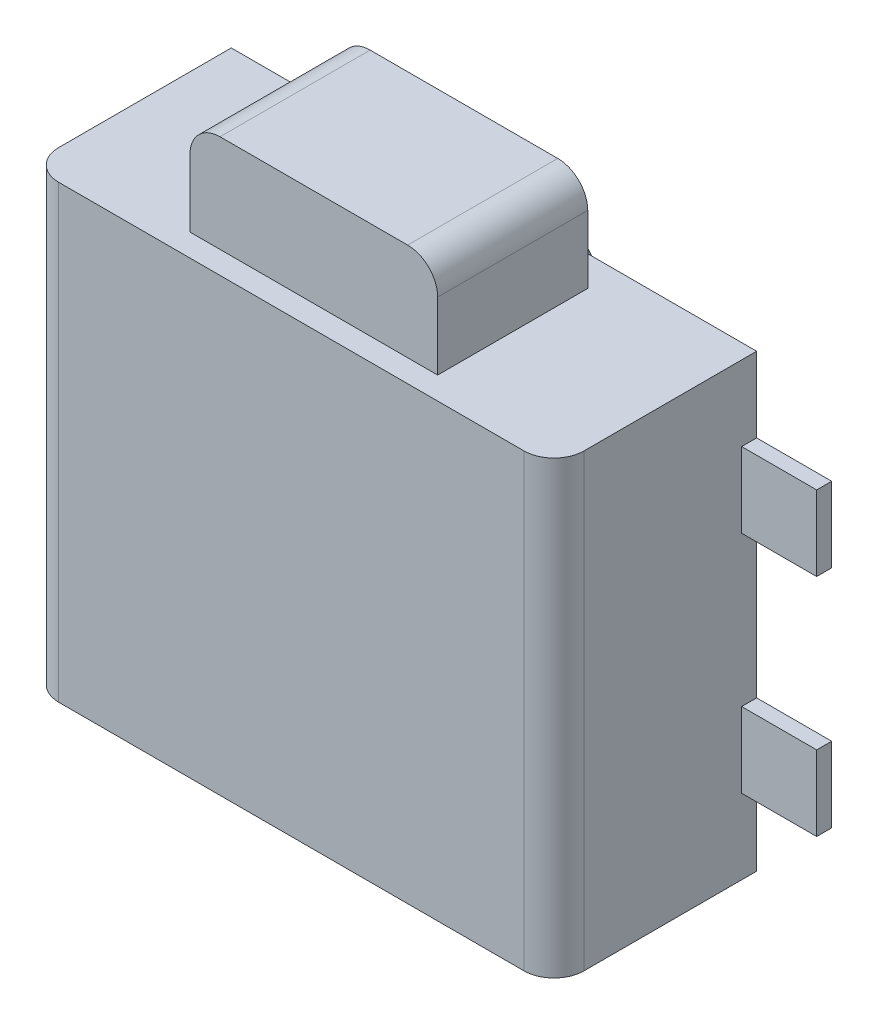
ISO-10303-21;
HEADER;
FILE_DESCRIPTION(('STEP AP214'),'2;1');
FILE_NAME('part.step','',(''),(''),'','','');
FILE_SCHEMA(('AUTOMOTIVE_DESIGN { 1 0 10303 214 1 1 1 1 }'));
ENDSEC;
DATA;
#1=APPLICATION_CONTEXT('core data for automotive mechanical design processes');
#2=APPLICATION_PROTOCOL_DEFINITION('international standard','automotive_design',2000,#1);
#3=PRODUCT_CONTEXT('',#1,'mechanical');
#4=PRODUCT('Part','Part','',(#3));
#5=PRODUCT_RELATED_PRODUCT_CATEGORY('part','',(#4));
#6=PRODUCT_DEFINITION_FORMATION('','',#4);
#7=PRODUCT_DEFINITION_CONTEXT('part definition',#1,'design');
#8=PRODUCT_DEFINITION('design','',#6,#7);
#9=PRODUCT_DEFINITION_SHAPE('','',#8);
#10=(LENGTH_UNIT() NAMED_UNIT(*) SI_UNIT(.MILLI.,.METRE.));
#11=(NAMED_UNIT(*) PLANE_ANGLE_UNIT() SI_UNIT($,.RADIAN.));
#12=(NAMED_UNIT(*) SI_UNIT($,.STERADIAN.) SOLID_ANGLE_UNIT());
#13=UNCERTAINTY_MEASURE_WITH_UNIT(LENGTH_MEASURE(1.E-05),#10,'distance_accuracy_value','');
#14=(GEOMETRIC_REPRESENTATION_CONTEXT(3) GLOBAL_UNCERTAINTY_ASSIGNED_CONTEXT((#13)) GLOBAL_UNIT_ASSIGNED_CONTEXT((#10,
#11,#12)) REPRESENTATION_CONTEXT('',''));
#15=CARTESIAN_POINT('',(0.,0.,0.));
#16=DIRECTION('',(0.,0.,1.));
#17=DIRECTION('',(1.,0.,0.));
#18=AXIS2_PLACEMENT_3D('',#15,#16,#17);
#19=CARTESIAN_POINT('',(-1.75,1.5,0.));
#20=DIRECTION('',(-1.,0.,0.));
#21=DIRECTION('',(0.,-1.,0.));
#22=AXIS2_PLACEMENT_3D('',#19,#20,#21);
#23=PLANE('',#22);
#24=DIRECTION('',(0.,0.,1.));
#25=VECTOR('',#24,1.);
#26=CARTESIAN_POINT('',(-1.75,0.999999999999999,0.));
#27=LINE('',#26,#25);
#28=CARTESIAN_POINT('',(-1.75,0.999999999999999,0.));
#29=VERTEX_POINT('',#28);
#30=CARTESIAN_POINT('',(-1.75,0.999999999999999,0.1));
#31=VERTEX_POINT('',#30);
#32=EDGE_CURVE('E260',#29,#31,#27,.T.);
#33=ORIENTED_EDGE('',*,*,#32,.T.);
#34=DIRECTION('',(0.,-1.,0.));
#35=VECTOR('',#34,1.);
#36=CARTESIAN_POINT('',(-1.75,1.5,0.1));
#37=LINE('',#36,#35);
#38=CARTESIAN_POINT('',(-1.75,0.499999999999999,0.1));
#39=VERTEX_POINT('',#38);
#40=EDGE_CURVE('E257',#31,#39,#37,.T.);
#41=ORIENTED_EDGE('',*,*,#40,.T.);
#42=DIRECTION('',(0.,0.,1.));
#43=VECTOR('',#42,1.);
#44=CARTESIAN_POINT('',(-1.75,0.499999999999999,0.));
#45=LINE('',#44,#43);
#46=CARTESIAN_POINT('',(-1.75,0.499999999999999,0.));
#47=VERTEX_POINT('',#46);
#48=EDGE_CURVE('E263',#39,#47,#45,.F.);
#49=ORIENTED_EDGE('',*,*,#48,.T.);
#50=DIRECTION('',(0.,-1.,0.));
#51=VECTOR('',#50,1.);
#52=CARTESIAN_POINT('',(-1.75,1.5,0.));
#53=LINE('',#52,#51);
#54=CARTESIAN_POINT('',(-1.75,-0.499999999999999,0.));
#55=VERTEX_POINT('',#54);
#56=EDGE_CURVE('E265',#47,#55,#53,.T.);
#57=ORIENTED_EDGE('',*,*,#56,.T.);
#58=DIRECTION('',(0.,0.,1.));
#59=VECTOR('',#58,1.);
#60=CARTESIAN_POINT('',(-1.75,-0.499999999999999,0.));
#61=LINE('',#60,#59);
#62=CARTESIAN_POINT('',(-1.75,-0.499999999999999,0.1));
#63=VERTEX_POINT('',#62);
#64=EDGE_CURVE('E276',#55,#63,#61,.T.);
#65=ORIENTED_EDGE('',*,*,#64,.T.);
#66=DIRECTION('',(0.,-1.,0.));
#67=VECTOR('',#66,1.);
#68=CARTESIAN_POINT('',(-1.75,1.5,0.1));
#69=LINE('',#68,#67);
#70=CARTESIAN_POINT('',(-1.75,-0.999999999999999,0.1));
#71=VERTEX_POINT('',#70);
#72=EDGE_CURVE('E285',#63,#71,#69,.T.);
#73=ORIENTED_EDGE('',*,*,#72,.T.);
#74=DIRECTION('',(0.,0.,1.));
#75=VECTOR('',#74,1.);
#76=CARTESIAN_POINT('',(-1.75,-0.999999999999999,0.));
#77=LINE('',#76,#75);
#78=CARTESIAN_POINT('',(-1.75,-0.999999999999999,0.));
#79=VERTEX_POINT('',#78);
#80=EDGE_CURVE('E295',#71,#79,#77,.F.);
#81=ORIENTED_EDGE('',*,*,#80,.T.);
#82=DIRECTION('',(0.,-1.,0.));
#83=VECTOR('',#82,1.);
#84=CARTESIAN_POINT('',(-1.75,1.5,0.));
#85=LINE('',#84,#83);
#86=CARTESIAN_POINT('',(-1.75,-1.5,0.));
#87=VERTEX_POINT('',#86);
#88=EDGE_CURVE('E201',#79,#87,#85,.T.);
#89=ORIENTED_EDGE('',*,*,#88,.T.);
#90=DIRECTION('',(0.,0.,1.));
#91=VECTOR('',#90,1.);
#92=CARTESIAN_POINT('',(-1.75,-1.5,0.));
#93=LINE('',#92,#91);
#94=CARTESIAN_POINT('',(-1.75,-1.5,1.15));
#95=VERTEX_POINT('',#94);
#96=EDGE_CURVE('E197',#87,#95,#93,.T.);
#97=ORIENTED_EDGE('',*,*,#96,.T.);
#98=DIRECTION('',(0.,-1.,0.));
#99=VECTOR('',#98,1.);
#100=CARTESIAN_POINT('',(-1.75,2.3,1.15));
#101=LINE('',#100,#99);
#102=CARTESIAN_POINT('',(-1.75,1.5,1.15));
#103=VERTEX_POINT('',#102);
#104=EDGE_CURVE('E199',#103,#95,#101,.T.);
#105=ORIENTED_EDGE('',*,*,#104,.F.);
#106=DIRECTION('',(0.,0.,1.));
#107=VECTOR('',#106,1.);
#108=CARTESIAN_POINT('',(-1.75,1.5,0.));
#109=LINE('',#108,#107);
#110=CARTESIAN_POINT('',(-1.75,1.5,0.));
#111=VERTEX_POINT('',#110);
#112=EDGE_CURVE('E206',#103,#111,#109,.F.);
#113=ORIENTED_EDGE('',*,*,#112,.T.);
#114=DIRECTION('',(0.,-1.,0.));
#115=VECTOR('',#114,1.);
#116=CARTESIAN_POINT('',(-1.75,1.5,0.));
#117=LINE('',#116,#115);
#118=EDGE_CURVE('E316',#111,#29,#117,.T.);
#119=ORIENTED_EDGE('',*,*,#118,.T.);
#120=EDGE_LOOP('',(#33,#41,#49,#57,#65,#73,#81,#89,#97,#105,#113,#119));
#121=FACE_BOUND('',#120,.T.);
#122=ADVANCED_FACE('F15',(#121),#23,.T.);
#123=CARTESIAN_POINT('',(1.75,-1.5,0.));
#124=DIRECTION('',(1.,0.,0.));
#125=DIRECTION('',(0.,1.,0.));
#126=AXIS2_PLACEMENT_3D('',#123,#124,#125);
#127=PLANE('',#126);
#128=DIRECTION('',(0.,0.,1.));
#129=VECTOR('',#128,1.);
#130=CARTESIAN_POINT('',(1.75,0.5,0.));
#131=LINE('',#130,#129);
#132=CARTESIAN_POINT('',(1.75,0.5,0.));
#133=VERTEX_POINT('',#132);
#134=CARTESIAN_POINT('',(1.75,0.5,0.1));
#135=VERTEX_POINT('',#134);
#136=EDGE_CURVE('E326',#133,#135,#131,.T.);
#137=ORIENTED_EDGE('',*,*,#136,.T.);
#138=DIRECTION('',(0.,1.,0.));
#139=VECTOR('',#138,1.);
#140=CARTESIAN_POINT('',(1.75,-1.5,0.1));
#141=LINE('',#140,#139);
#142=CARTESIAN_POINT('',(1.75,1.,0.1));
#143=VERTEX_POINT('',#142);
#144=EDGE_CURVE('E215',#135,#143,#141,.T.);
#145=ORIENTED_EDGE('',*,*,#144,.T.);
#146=DIRECTION('',(0.,0.,1.));
#147=VECTOR('',#146,1.);
#148=CARTESIAN_POINT('',(1.75,1.,0.));
#149=LINE('',#148,#147);
#150=CARTESIAN_POINT('',(1.75,1.,0.));
#151=VERTEX_POINT('',#150);
#152=EDGE_CURVE('E259',#143,#151,#149,.F.);
#153=ORIENTED_EDGE('',*,*,#152,.T.);
#154=DIRECTION('',(0.,1.,0.));
#155=VECTOR('',#154,1.);
#156=CARTESIAN_POINT('',(1.75,-1.5,0.));
#157=LINE('',#156,#155);
#158=CARTESIAN_POINT('',(1.75,1.5,0.));
#159=VERTEX_POINT('',#158);
#160=EDGE_CURVE('E330',#151,#159,#157,.T.);
#161=ORIENTED_EDGE('',*,*,#160,.T.);
#162=DIRECTION('',(0.,0.,1.));
#163=VECTOR('',#162,1.);
#164=CARTESIAN_POINT('',(1.75,1.5,0.));
#165=LINE('',#164,#163);
#166=CARTESIAN_POINT('',(1.75,1.5,1.15));
#167=VERTEX_POINT('',#166);
#168=EDGE_CURVE('E339',#159,#167,#165,.T.);
#169=ORIENTED_EDGE('',*,*,#168,.T.);
#170=DIRECTION('',(0.,1.,0.));
#171=VECTOR('',#170,1.);
#172=CARTESIAN_POINT('',(1.75,-2.3,1.15));
#173=LINE('',#172,#171);
#174=CARTESIAN_POINT('',(1.75,-1.5,1.15));
#175=VERTEX_POINT('',#174);
#176=EDGE_CURVE('E221',#175,#167,#173,.T.);
#177=ORIENTED_EDGE('',*,*,#176,.F.);
#178=DIRECTION('',(0.,0.,1.));
#179=VECTOR('',#178,1.);
#180=CARTESIAN_POINT('',(1.75,-1.5,0.));
#181=LINE('',#180,#179);
#182=CARTESIAN_POINT('',(1.75,-1.5,0.));
#183=VERTEX_POINT('',#182);
#184=EDGE_CURVE('E349',#175,#183,#181,.F.);
#185=ORIENTED_EDGE('',*,*,#184,.T.);
#186=DIRECTION('',(0.,1.,0.));
#187=VECTOR('',#186,1.);
#188=CARTESIAN_POINT('',(1.75,-1.5,0.));
#189=LINE('',#188,#187);
#190=CARTESIAN_POINT('',(1.75,-1.,0.));
#191=VERTEX_POINT('',#190);
#192=EDGE_CURVE('E346',#183,#191,#189,.T.);
#193=ORIENTED_EDGE('',*,*,#192,.T.);
#194=DIRECTION('',(0.,0.,1.));
#195=VECTOR('',#194,1.);
#196=CARTESIAN_POINT('',(1.75,-1.,0.));
#197=LINE('',#196,#195);
#198=CARTESIAN_POINT('',(1.75,-1.,0.1));
#199=VERTEX_POINT('',#198);
#200=EDGE_CURVE('E348',#191,#199,#197,.T.);
#201=ORIENTED_EDGE('',*,*,#200,.T.);
#202=DIRECTION('',(0.,1.,0.));
#203=VECTOR('',#202,1.);
#204=CARTESIAN_POINT('',(1.75,-1.5,0.1));
#205=LINE('',#204,#203);
#206=CARTESIAN_POINT('',(1.75,-0.5,0.1));
#207=VERTEX_POINT('',#206);
#208=EDGE_CURVE('E367',#199,#207,#205,.T.);
#209=ORIENTED_EDGE('',*,*,#208,.T.);
#210=DIRECTION('',(0.,0.,1.));
#211=VECTOR('',#210,1.);
#212=CARTESIAN_POINT('',(1.75,-0.5,0.));
#213=LINE('',#212,#211);
#214=CARTESIAN_POINT('',(1.75,-0.5,0.));
#215=VERTEX_POINT('',#214);
#216=EDGE_CURVE('E369',#207,#215,#213,.F.);
#217=ORIENTED_EDGE('',*,*,#216,.T.);
#218=DIRECTION('',(0.,1.,0.));
#219=VECTOR('',#218,1.);
#220=CARTESIAN_POINT('',(1.75,-1.5,0.));
#221=LINE('',#220,#219);
#222=EDGE_CURVE('E371',#215,#133,#221,.T.);
#223=ORIENTED_EDGE('',*,*,#222,.T.);
#224=EDGE_LOOP('',(#137,#145,#153,#161,#169,#177,#185,#193,#201,#209,#217,#223));
#225=FACE_BOUND('',#224,.T.);
#226=ADVANCED_FACE('F577',(#225),#127,.T.);
#227=CARTESIAN_POINT('',(-1.55,2.3,1.15));
#228=DIRECTION('',(0.,-1.,0.));
#229=DIRECTION('',(1.,0.,0.));
#230=AXIS2_PLACEMENT_3D('',#227,#228,#229);
#231=CYLINDRICAL_SURFACE('',#230,0.2);
#232=DIRECTION('',(0.,1.,0.));
#233=VECTOR('',#232,1.);
#234=CARTESIAN_POINT('',(-1.55,0.,1.35));
#235=LINE('',#234,#233);
#236=CARTESIAN_POINT('',(-1.55,1.5,1.35));
#237=VERTEX_POINT('',#236);
#238=CARTESIAN_POINT('',(-1.55,-1.5,1.35));
#239=VERTEX_POINT('',#238);
#240=EDGE_CURVE('E388',#237,#239,#235,.F.);
#241=ORIENTED_EDGE('',*,*,#240,.F.);
#242=CARTESIAN_POINT('',(-1.55,1.5,1.15));
#243=DIRECTION('',(0.,-1.,0.));
#244=DIRECTION('',(1.,0.,0.));
#245=AXIS2_PLACEMENT_3D('',#242,#243,#244);
#246=CIRCLE('',#245,0.2);
#247=EDGE_CURVE('E214',#237,#103,#246,.T.);
#248=ORIENTED_EDGE('',*,*,#247,.T.);
#249=ORIENTED_EDGE('',*,*,#104,.T.);
#250=CARTESIAN_POINT('',(-1.55,-1.5,1.15));
#251=DIRECTION('',(0.,-1.,0.));
#252=DIRECTION('',(1.,0.,0.));
#253=AXIS2_PLACEMENT_3D('',#250,#251,#252);
#254=CIRCLE('',#253,0.2);
#255=EDGE_CURVE('E18',#95,#239,#254,.F.);
#256=ORIENTED_EDGE('',*,*,#255,.T.);
#257=EDGE_LOOP('',(#241,#248,#249,#256));
#258=FACE_BOUND('',#257,.T.);
#259=ADVANCED_FACE('F212',(#258),#231,.T.);
#260=CARTESIAN_POINT('',(1.55,-2.3,1.15));
#261=DIRECTION('',(0.,1.,0.));
#262=DIRECTION('',(-1.,0.,0.));
#263=AXIS2_PLACEMENT_3D('',#260,#261,#262);
#264=CYLINDRICAL_SURFACE('',#263,0.2);
#265=DIRECTION('',(0.,1.,0.));
#266=VECTOR('',#265,1.);
#267=CARTESIAN_POINT('',(1.55,0.,1.35));
#268=LINE('',#267,#266);
#269=CARTESIAN_POINT('',(1.55,-1.5,1.35));
#270=VERTEX_POINT('',#269);
#271=CARTESIAN_POINT('',(1.55,1.5,1.35));
#272=VERTEX_POINT('',#271);
#273=EDGE_CURVE('E394',#270,#272,#268,.T.);
#274=ORIENTED_EDGE('',*,*,#273,.F.);
#275=CARTESIAN_POINT('',(1.55,-1.5,1.15));
#276=DIRECTION('',(0.,1.,0.));
#277=DIRECTION('',(-1.,0.,0.));
#278=AXIS2_PLACEMENT_3D('',#275,#276,#277);
#279=CIRCLE('',#278,0.2);
#280=EDGE_CURVE('E227',#270,#175,#279,.T.);
#281=ORIENTED_EDGE('',*,*,#280,.T.);
#282=ORIENTED_EDGE('',*,*,#176,.T.);
#283=CARTESIAN_POINT('',(1.55,1.5,1.15));
#284=DIRECTION('',(0.,1.,0.));
#285=DIRECTION('',(-1.,0.,0.));
#286=AXIS2_PLACEMENT_3D('',#283,#284,#285);
#287=CIRCLE('',#286,0.2);
#288=EDGE_CURVE('E223',#167,#272,#287,.F.);
#289=ORIENTED_EDGE('',*,*,#288,.T.);
#290=EDGE_LOOP('',(#274,#281,#282,#289));
#291=FACE_BOUND('',#290,.T.);
#292=ADVANCED_FACE('F598',(#291),#264,.T.);
#293=CARTESIAN_POINT('',(0.625,1.95,2.));
#294=DIRECTION('',(0.,0.,-1.));
#295=DIRECTION('',(-1.,0.,0.));
#296=AXIS2_PLACEMENT_3D('',#293,#294,#295);
#297=CYLINDRICAL_SURFACE('',#296,0.2);
#298=DIRECTION('',(0.,0.,1.));
#299=VECTOR('',#298,1.);
#300=CARTESIAN_POINT('',(0.625,2.15,0.));
#301=LINE('',#300,#299);
#302=CARTESIAN_POINT('',(0.625,2.15,1.2));
#303=VERTEX_POINT('',#302);
#304=CARTESIAN_POINT('',(0.625,2.15,0.2));
#305=VERTEX_POINT('',#304);
#306=EDGE_CURVE('E230',#303,#305,#301,.F.);
#307=ORIENTED_EDGE('',*,*,#306,.F.);
#308=CARTESIAN_POINT('',(0.625,1.95,1.2));
#309=DIRECTION('',(0.,0.,-1.));
#310=DIRECTION('',(-1.,0.,0.));
#311=AXIS2_PLACEMENT_3D('',#308,#309,#310);
#312=CIRCLE('',#311,0.2);
#313=CARTESIAN_POINT('',(0.825,1.95,1.2));
#314=VERTEX_POINT('',#313);
#315=EDGE_CURVE('E239',#314,#303,#312,.F.);
#316=ORIENTED_EDGE('',*,*,#315,.F.);
#317=DIRECTION('',(0.,0.,-1.));
#318=VECTOR('',#317,1.);
#319=CARTESIAN_POINT('',(0.825,1.95,1.2));
#320=LINE('',#319,#318);
#321=CARTESIAN_POINT('',(0.825,1.95,0.2));
#322=VERTEX_POINT('',#321);
#323=EDGE_CURVE('E384',#322,#314,#320,.F.);
#324=ORIENTED_EDGE('',*,*,#323,.F.);
#325=CARTESIAN_POINT('',(0.625,1.95,0.2));
#326=DIRECTION('',(0.,0.,-1.));
#327=DIRECTION('',(-1.,0.,0.));
#328=AXIS2_PLACEMENT_3D('',#325,#326,#327);
#329=CIRCLE('',#328,0.2);
#330=EDGE_CURVE('E231',#305,#322,#329,.T.);
#331=ORIENTED_EDGE('',*,*,#330,.F.);
#332=EDGE_LOOP('',(#307,#316,#324,#331));
#333=FACE_BOUND('',#332,.T.);
#334=ADVANCED_FACE('F733',(#333),#297,.T.);
#335=CARTESIAN_POINT('',(0.,2.15,0.));
#336=DIRECTION('',(0.,1.,0.));
#337=DIRECTION('',(-1.,0.,0.));
#338=AXIS2_PLACEMENT_3D('',#335,#336,#337);
#339=PLANE('',#338);
#340=DIRECTION('',(0.,0.,1.));
#341=VECTOR('',#340,1.);
#342=CARTESIAN_POINT('',(-0.625,2.15,-0.6));
#343=LINE('',#342,#341);
#344=CARTESIAN_POINT('',(-0.625,2.15,1.2));
#345=VERTEX_POINT('',#344);
#346=CARTESIAN_POINT('',(-0.625,2.15,0.2));
#347=VERTEX_POINT('',#346);
#348=EDGE_CURVE('E386',#345,#347,#343,.F.);
#349=ORIENTED_EDGE('',*,*,#348,.F.);
#350=DIRECTION('',(1.,0.,0.));
#351=VECTOR('',#350,1.);
#352=CARTESIAN_POINT('',(-0.825,2.15,1.2));
#353=LINE('',#352,#351);
#354=EDGE_CURVE('E241',#303,#345,#353,.F.);
#355=ORIENTED_EDGE('',*,*,#354,.F.);
#356=ORIENTED_EDGE('',*,*,#306,.T.);
#357=DIRECTION('',(-1.,0.,0.));
#358=VECTOR('',#357,1.);
#359=CARTESIAN_POINT('',(0.825,2.15,0.2));
#360=LINE('',#359,#358);
#361=EDGE_CURVE('E238',#347,#305,#360,.F.);
#362=ORIENTED_EDGE('',*,*,#361,.F.);
#363=EDGE_LOOP('',(#349,#355,#356,#362));
#364=FACE_BOUND('',#363,.T.);
#365=ADVANCED_FACE('F743',(#364),#339,.T.);
#366=CARTESIAN_POINT('',(-0.625,1.95,-0.6));
#367=DIRECTION('',(0.,0.,1.));
#368=DIRECTION('',(1.,0.,0.));
#369=AXIS2_PLACEMENT_3D('',#366,#367,#368);
#370=CYLINDRICAL_SURFACE('',#369,0.2);
#371=ORIENTED_EDGE('',*,*,#348,.T.);
#372=CARTESIAN_POINT('',(-0.625,1.95,0.2));
#373=DIRECTION('',(0.,0.,1.));
#374=DIRECTION('',(1.,0.,0.));
#375=AXIS2_PLACEMENT_3D('',#372,#373,#374);
#376=CIRCLE('',#375,0.2);
#377=CARTESIAN_POINT('',(-0.825,1.95,0.2));
#378=VERTEX_POINT('',#377);
#379=EDGE_CURVE('E235',#378,#347,#376,.F.);
#380=ORIENTED_EDGE('',*,*,#379,.F.);
#381=DIRECTION('',(0.,0.,1.));
#382=VECTOR('',#381,1.);
#383=CARTESIAN_POINT('',(-0.825,1.95,0.2));
#384=LINE('',#383,#382);
#385=CARTESIAN_POINT('',(-0.825,1.95,1.2));
#386=VERTEX_POINT('',#385);
#387=EDGE_CURVE('E234',#386,#378,#384,.F.);
#388=ORIENTED_EDGE('',*,*,#387,.F.);
#389=CARTESIAN_POINT('',(-0.625,1.95,1.2));
#390=DIRECTION('',(0.,0.,1.));
#391=DIRECTION('',(1.,0.,0.));
#392=AXIS2_PLACEMENT_3D('',#389,#390,#391);
#393=CIRCLE('',#392,0.2);
#394=EDGE_CURVE('E243',#345,#386,#393,.T.);
#395=ORIENTED_EDGE('',*,*,#394,.F.);
#396=EDGE_LOOP('',(#371,#380,#388,#395));
#397=FACE_BOUND('',#396,.T.);
#398=ADVANCED_FACE('F478',(#397),#370,.T.);
#399=CARTESIAN_POINT('',(0.,0.,-0.5));
#400=DIRECTION('',(0.,0.,-1.));
#401=DIRECTION('',(-1.,0.,0.));
#402=AXIS2_PLACEMENT_3D('',#399,#400,#401);
#403=PLANE('',#402);
#404=CARTESIAN_POINT('',(0.,0.9,-0.5));
#405=DIRECTION('',(0.,0.,1.));
#406=DIRECTION('',(1.,0.,0.));
#407=AXIS2_PLACEMENT_3D('',#404,#405,#406);
#408=CIRCLE('',#407,0.15);
#409=CARTESIAN_POINT('',(0.15,0.9,-0.5));
#410=VERTEX_POINT('',#409);
#411=EDGE_CURVE('E436',#410,#410,#408,.T.);
#412=ORIENTED_EDGE('',*,*,#411,.F.);
#413=EDGE_LOOP('',(#412));
#414=FACE_BOUND('',#413,.T.);
#415=ADVANCED_FACE('F473',(#414),#403,.T.);
#416=CARTESIAN_POINT('',(0.,0.,-0.5));
#417=DIRECTION('',(0.,0.,-1.));
#418=DIRECTION('',(-1.,0.,0.));
#419=AXIS2_PLACEMENT_3D('',#416,#417,#418);
#420=PLANE('',#419);
#421=CARTESIAN_POINT('',(0.,-0.9,-0.5));
#422=DIRECTION('',(0.,0.,1.));
#423=DIRECTION('',(1.,0.,0.));
#424=AXIS2_PLACEMENT_3D('',#421,#422,#423);
#425=CIRCLE('',#424,0.15);
#426=CARTESIAN_POINT('',(0.15,-0.9,-0.5));
#427=VERTEX_POINT('',#426);
#428=EDGE_CURVE('E456',#427,#427,#425,.T.);
#429=ORIENTED_EDGE('',*,*,#428,.F.);
#430=EDGE_LOOP('',(#429));
#431=FACE_BOUND('',#430,.T.);
#432=ADVANCED_FACE('F462',(#431),#420,.T.);
#433=CARTESIAN_POINT('',(0.,0.,0.1));
#434=DIRECTION('',(0.,0.,-1.));
#435=DIRECTION('',(-1.,0.,0.));
#436=AXIS2_PLACEMENT_3D('',#433,#434,#435);
#437=PLANE('',#436);
#438=DIRECTION('',(-1.,0.,0.));
#439=VECTOR('',#438,1.);
#440=CARTESIAN_POINT('',(-2.25,0.999999999999999,0.1));
#441=LINE('',#440,#439);
#442=CARTESIAN_POINT('',(-2.25,0.999999999999999,0.1));
#443=VERTEX_POINT('',#442);
#444=EDGE_CURVE('E497',#443,#31,#441,.F.);
#445=ORIENTED_EDGE('',*,*,#444,.F.);
#446=DIRECTION('',(0.,-1.,0.));
#447=VECTOR('',#446,1.);
#448=CARTESIAN_POINT('',(-2.25,0.499999999999999,0.1));
#449=LINE('',#448,#447);
#450=CARTESIAN_POINT('',(-2.25,0.499999999999999,0.1));
#451=VERTEX_POINT('',#450);
#452=EDGE_CURVE('E500',#451,#443,#449,.F.);
#453=ORIENTED_EDGE('',*,*,#452,.F.);
#454=DIRECTION('',(1.,0.,0.));
#455=VECTOR('',#454,1.);
#456=CARTESIAN_POINT('',(-1.75,0.499999999999999,0.1));
#457=LINE('',#456,#455);
#458=EDGE_CURVE('E251',#39,#451,#457,.F.);
#459=ORIENTED_EDGE('',*,*,#458,.F.);
#460=ORIENTED_EDGE('',*,*,#40,.F.);
#461=EDGE_LOOP('',(#445,#453,#459,#460));
#462=FACE_BOUND('',#461,.T.);
#463=ADVANCED_FACE('F472',(#462),#437,.F.);
#464=CARTESIAN_POINT('',(0.,0.,0.1));
#465=DIRECTION('',(0.,0.,-1.));
#466=DIRECTION('',(-1.,0.,0.));
#467=AXIS2_PLACEMENT_3D('',#464,#465,#466);
#468=PLANE('',#467);
#469=DIRECTION('',(-1.,0.,0.));
#470=VECTOR('',#469,1.);
#471=CARTESIAN_POINT('',(-2.25,-0.499999999999999,0.1));
#472=LINE('',#471,#470);
#473=CARTESIAN_POINT('',(-2.25,-0.499999999999999,0.1));
#474=VERTEX_POINT('',#473);
#475=EDGE_CURVE('E288',#474,#63,#472,.F.);
#476=ORIENTED_EDGE('',*,*,#475,.F.);
#477=DIRECTION('',(0.,-1.,0.));
#478=VECTOR('',#477,1.);
#479=CARTESIAN_POINT('',(-2.25,-0.999999999999999,0.1));
#480=LINE('',#479,#478);
#481=CARTESIAN_POINT('',(-2.25,-0.999999999999999,0.1));
#482=VERTEX_POINT('',#481);
#483=EDGE_CURVE('E291',#482,#474,#480,.F.);
#484=ORIENTED_EDGE('',*,*,#483,.F.);
#485=DIRECTION('',(1.,0.,0.));
#486=VECTOR('',#485,1.);
#487=CARTESIAN_POINT('',(-1.75,-0.999999999999999,0.1));
#488=LINE('',#487,#486);
#489=EDGE_CURVE('E298',#71,#482,#488,.F.);
#490=ORIENTED_EDGE('',*,*,#489,.F.);
#491=ORIENTED_EDGE('',*,*,#72,.F.);
#492=EDGE_LOOP('',(#476,#484,#490,#491));
#493=FACE_BOUND('',#492,.T.);
#494=ADVANCED_FACE('F689',(#493),#468,.F.);
#495=CARTESIAN_POINT('',(0.,0.,0.1));
#496=DIRECTION('',(0.,0.,-1.));
#497=DIRECTION('',(-1.,0.,0.));
#498=AXIS2_PLACEMENT_3D('',#495,#496,#497);
#499=PLANE('',#498);
#500=DIRECTION('',(1.,0.,0.));
#501=VECTOR('',#500,1.);
#502=CARTESIAN_POINT('',(2.25,-1.,0.1));
#503=LINE('',#502,#501);
#504=CARTESIAN_POINT('',(2.25,-1.,0.1));
#505=VERTEX_POINT('',#504);
#506=EDGE_CURVE('E514',#505,#199,#503,.F.);
#507=ORIENTED_EDGE('',*,*,#506,.F.);
#508=DIRECTION('',(0.,1.,0.));
#509=VECTOR('',#508,1.);
#510=CARTESIAN_POINT('',(2.25,-0.5,0.1));
#511=LINE('',#510,#509);
#512=CARTESIAN_POINT('',(2.25,-0.5,0.1));
#513=VERTEX_POINT('',#512);
#514=EDGE_CURVE('E517',#513,#505,#511,.F.);
#515=ORIENTED_EDGE('',*,*,#514,.F.);
#516=DIRECTION('',(1.,0.,0.));
#517=VECTOR('',#516,1.);
#518=CARTESIAN_POINT('',(1.75,-0.5,0.1));
#519=LINE('',#518,#517);
#520=EDGE_CURVE('E521',#207,#513,#519,.T.);
#521=ORIENTED_EDGE('',*,*,#520,.F.);
#522=ORIENTED_EDGE('',*,*,#208,.F.);
#523=EDGE_LOOP('',(#507,#515,#521,#522));
#524=FACE_BOUND('',#523,.T.);
#525=ADVANCED_FACE('F693',(#524),#499,.F.);
#526=CARTESIAN_POINT('',(0.,0.,0.1));
#527=DIRECTION('',(0.,0.,-1.));
#528=DIRECTION('',(-1.,0.,0.));
#529=AXIS2_PLACEMENT_3D('',#526,#527,#528);
#530=PLANE('',#529);
#531=DIRECTION('',(1.,0.,0.));
#532=VECTOR('',#531,1.);
#533=CARTESIAN_POINT('',(2.25,0.5,0.1));
#534=LINE('',#533,#532);
#535=CARTESIAN_POINT('',(2.25,0.5,0.1));
#536=VERTEX_POINT('',#535);
#537=EDGE_CURVE('E525',#536,#135,#534,.F.);
#538=ORIENTED_EDGE('',*,*,#537,.F.);
#539=DIRECTION('',(0.,1.,0.));
#540=VECTOR('',#539,1.);
#541=CARTESIAN_POINT('',(2.25,1.,0.1));
#542=LINE('',#541,#540);
#543=CARTESIAN_POINT('',(2.25,1.,0.1));
#544=VERTEX_POINT('',#543);
#545=EDGE_CURVE('E528',#544,#536,#542,.F.);
#546=ORIENTED_EDGE('',*,*,#545,.F.);
#547=DIRECTION('',(1.,0.,0.));
#548=VECTOR('',#547,1.);
#549=CARTESIAN_POINT('',(1.75,1.,0.1));
#550=LINE('',#549,#548);
#551=EDGE_CURVE('E320',#143,#544,#550,.T.);
#552=ORIENTED_EDGE('',*,*,#551,.F.);
#553=ORIENTED_EDGE('',*,*,#144,.F.);
#554=EDGE_LOOP('',(#538,#546,#552,#553));
#555=FACE_BOUND('',#554,.T.);
#556=ADVANCED_FACE('F698',(#555),#530,.F.);
#557=CARTESIAN_POINT('',(0.,0.,1.35));
#558=DIRECTION('',(0.,0.,1.));
#559=DIRECTION('',(1.,0.,0.));
#560=AXIS2_PLACEMENT_3D('',#557,#558,#559);
#561=PLANE('',#560);
#562=ORIENTED_EDGE('',*,*,#273,.T.);
#563=DIRECTION('',(-1.,0.,0.));
#564=VECTOR('',#563,1.);
#565=CARTESIAN_POINT('',(1.75,1.5,1.35));
#566=LINE('',#565,#564);
#567=EDGE_CURVE('E392',#237,#272,#566,.F.);
#568=ORIENTED_EDGE('',*,*,#567,.F.);
#569=ORIENTED_EDGE('',*,*,#240,.T.);
#570=DIRECTION('',(1.,0.,0.));
#571=VECTOR('',#570,1.);
#572=CARTESIAN_POINT('',(-1.75,-1.5,1.35));
#573=LINE('',#572,#571);
#574=EDGE_CURVE('E220',#270,#239,#573,.F.);
#575=ORIENTED_EDGE('',*,*,#574,.F.);
#576=EDGE_LOOP('',(#562,#568,#569,#575));
#577=FACE_BOUND('',#576,.T.);
#578=ADVANCED_FACE('F602',(#577),#561,.T.);
#579=CARTESIAN_POINT('',(-0.825,1.5,0.2));
#580=DIRECTION('',(-1.,0.,0.));
#581=DIRECTION('',(0.,0.,1.));
#582=AXIS2_PLACEMENT_3D('',#579,#580,#581);
#583=PLANE('',#582);
#584=DIRECTION('',(0.,0.,1.));
#585=VECTOR('',#584,1.);
#586=CARTESIAN_POINT('',(-0.825,1.5,0.));
#587=LINE('',#586,#585);
#588=CARTESIAN_POINT('',(-0.825,1.5,1.2));
#589=VERTEX_POINT('',#588);
#590=CARTESIAN_POINT('',(-0.825,1.5,0.2));
#591=VERTEX_POINT('',#590);
#592=EDGE_CURVE('E379',#589,#591,#587,.F.);
#593=ORIENTED_EDGE('',*,*,#592,.F.);
#594=DIRECTION('',(0.,1.,0.));
#595=VECTOR('',#594,1.);
#596=CARTESIAN_POINT('',(-0.825,1.5,1.2));
#597=LINE('',#596,#595);
#598=EDGE_CURVE('E245',#386,#589,#597,.F.);
#599=ORIENTED_EDGE('',*,*,#598,.F.);
#600=ORIENTED_EDGE('',*,*,#387,.T.);
#601=DIRECTION('',(0.,1.,0.));
#602=VECTOR('',#601,1.);
#603=CARTESIAN_POINT('',(-0.825,1.5,0.2));
#604=LINE('',#603,#602);
#605=EDGE_CURVE('E233',#591,#378,#604,.T.);
#606=ORIENTED_EDGE('',*,*,#605,.F.);
#607=EDGE_LOOP('',(#593,#599,#600,#606));
#608=FACE_BOUND('',#607,.T.);
#609=ADVANCED_FACE('F707',(#608),#583,.T.);
#610=CARTESIAN_POINT('',(0.825,1.5,0.2));
#611=DIRECTION('',(0.,0.,-1.));
#612=DIRECTION('',(-1.,0.,0.));
#613=AXIS2_PLACEMENT_3D('',#610,#611,#612);
#614=PLANE('',#613);
#615=ORIENTED_EDGE('',*,*,#379,.T.);
#616=ORIENTED_EDGE('',*,*,#361,.T.);
#617=ORIENTED_EDGE('',*,*,#330,.T.);
#618=DIRECTION('',(0.,1.,0.));
#619=VECTOR('',#618,1.);
#620=CARTESIAN_POINT('',(0.825,1.5,0.2));
#621=LINE('',#620,#619);
#622=CARTESIAN_POINT('',(0.825,1.5,0.2));
#623=VERTEX_POINT('',#622);
#624=EDGE_CURVE('E242',#623,#322,#621,.T.);
#625=ORIENTED_EDGE('',*,*,#624,.F.);
#626=DIRECTION('',(-1.,0.,0.));
#627=VECTOR('',#626,1.);
#628=CARTESIAN_POINT('',(1.75,1.5,0.2));
#629=LINE('',#628,#627);
#630=EDGE_CURVE('E376',#591,#623,#629,.F.);
#631=ORIENTED_EDGE('',*,*,#630,.F.);
#632=ORIENTED_EDGE('',*,*,#605,.T.);
#633=EDGE_LOOP('',(#615,#616,#617,#625,#631,#632));
#634=FACE_BOUND('',#633,.T.);
#635=ADVANCED_FACE('F710',(#634),#614,.T.);
#636=CARTESIAN_POINT('',(0.825,1.5,1.2));
#637=DIRECTION('',(1.,0.,0.));
#638=DIRECTION('',(0.,0.,-1.));
#639=AXIS2_PLACEMENT_3D('',#636,#637,#638);
#640=PLANE('',#639);
#641=DIRECTION('',(0.,0.,1.));
#642=VECTOR('',#641,1.);
#643=CARTESIAN_POINT('',(0.825,1.5,0.));
#644=LINE('',#643,#642);
#645=CARTESIAN_POINT('',(0.825,1.5,1.2));
#646=VERTEX_POINT('',#645);
#647=EDGE_CURVE('E378',#623,#646,#644,.T.);
#648=ORIENTED_EDGE('',*,*,#647,.F.);
#649=ORIENTED_EDGE('',*,*,#624,.T.);
#650=ORIENTED_EDGE('',*,*,#323,.T.);
#651=DIRECTION('',(0.,1.,0.));
#652=VECTOR('',#651,1.);
#653=CARTESIAN_POINT('',(0.825,1.5,1.2));
#654=LINE('',#653,#652);
#655=EDGE_CURVE('E433',#646,#314,#654,.T.);
#656=ORIENTED_EDGE('',*,*,#655,.F.);
#657=EDGE_LOOP('',(#648,#649,#650,#656));
#658=FACE_BOUND('',#657,.T.);
#659=ADVANCED_FACE('F713',(#658),#640,.T.);
#660=CARTESIAN_POINT('',(-0.825,1.5,1.2));
#661=DIRECTION('',(0.,0.,1.));
#662=DIRECTION('',(1.,0.,0.));
#663=AXIS2_PLACEMENT_3D('',#660,#661,#662);
#664=PLANE('',#663);
#665=DIRECTION('',(-1.,0.,0.));
#666=VECTOR('',#665,1.);
#667=CARTESIAN_POINT('',(1.75,1.5,1.2));
#668=LINE('',#667,#666);
#669=EDGE_CURVE('E397',#646,#589,#668,.T.);
#670=ORIENTED_EDGE('',*,*,#669,.F.);
#671=ORIENTED_EDGE('',*,*,#655,.T.);
#672=ORIENTED_EDGE('',*,*,#315,.T.);
#673=ORIENTED_EDGE('',*,*,#354,.T.);
#674=ORIENTED_EDGE('',*,*,#394,.T.);
#675=ORIENTED_EDGE('',*,*,#598,.T.);
#676=EDGE_LOOP('',(#670,#671,#672,#673,#674,#675));
#677=FACE_BOUND('',#676,.T.);
#678=ADVANCED_FACE('F423',(#677),#664,.T.);
#679=CARTESIAN_POINT('',(0.,0.9,-0.4));
#680=DIRECTION('',(0.,0.,-1.));
#681=DIRECTION('',(1.,0.,0.));
#682=AXIS2_PLACEMENT_3D('',#679,#680,#681);
#683=TOROIDAL_SURFACE('',#682,0.15,0.1);
#684=ORIENTED_EDGE('',*,*,#411,.T.);
#685=EDGE_LOOP('',(#684));
#686=FACE_BOUND('',#685,.T.);
#687=CARTESIAN_POINT('',(0.,0.9,-0.4));
#688=DIRECTION('',(0.,0.,-1.));
#689=DIRECTION('',(-1.,0.,0.));
#690=AXIS2_PLACEMENT_3D('',#687,#688,#689);
#691=CIRCLE('',#690,0.25);
#692=CARTESIAN_POINT('',(-0.25,0.9,-0.4));
#693=VERTEX_POINT('',#692);
#694=EDGE_CURVE('E400',#693,#693,#691,.F.);
#695=ORIENTED_EDGE('',*,*,#694,.F.);
#696=EDGE_LOOP('',(#695));
#697=FACE_BOUND('',#696,.T.);
#698=ADVANCED_FACE('F411',(#686,#697),#683,.T.);
#699=CARTESIAN_POINT('',(0.,-0.9,-0.4));
#700=DIRECTION('',(0.,0.,-1.));
#701=DIRECTION('',(1.,0.,0.));
#702=AXIS2_PLACEMENT_3D('',#699,#700,#701);
#703=TOROIDAL_SURFACE('',#702,0.15,0.1);
#704=ORIENTED_EDGE('',*,*,#428,.T.);
#705=EDGE_LOOP('',(#704));
#706=FACE_BOUND('',#705,.T.);
#707=CARTESIAN_POINT('',(0.,-0.9,-0.4));
#708=DIRECTION('',(0.,0.,-1.));
#709=DIRECTION('',(-1.,0.,0.));
#710=AXIS2_PLACEMENT_3D('',#707,#708,#709);
#711=CIRCLE('',#710,0.25);
#712=CARTESIAN_POINT('',(-0.25,-0.9,-0.4));
#713=VERTEX_POINT('',#712);
#714=EDGE_CURVE('E538',#713,#713,#711,.F.);
#715=ORIENTED_EDGE('',*,*,#714,.F.);
#716=EDGE_LOOP('',(#715));
#717=FACE_BOUND('',#716,.T.);
#718=ADVANCED_FACE('F422',(#706,#717),#703,.T.);
#719=CARTESIAN_POINT('',(-2.25,0.999999999999999,0.1));
#720=DIRECTION('',(0.,1.,0.));
#721=DIRECTION('',(-1.,0.,0.));
#722=AXIS2_PLACEMENT_3D('',#719,#720,#721);
#723=PLANE('',#722);
#724=DIRECTION('',(0.,0.,1.));
#725=VECTOR('',#724,1.);
#726=CARTESIAN_POINT('',(-2.25,0.999999999999999,0.1));
#727=LINE('',#726,#725);
#728=CARTESIAN_POINT('',(-2.25,0.999999999999999,0.));
#729=VERTEX_POINT('',#728);
#730=EDGE_CURVE('E254',#443,#729,#727,.F.);
#731=ORIENTED_EDGE('',*,*,#730,.F.);
#732=ORIENTED_EDGE('',*,*,#444,.T.);
#733=ORIENTED_EDGE('',*,*,#32,.F.);
#734=DIRECTION('',(1.,0.,0.));
#735=VECTOR('',#734,1.);
#736=CARTESIAN_POINT('',(0.,0.999999999999999,0.));
#737=LINE('',#736,#735);
#738=EDGE_CURVE('E543',#29,#729,#737,.F.);
#739=ORIENTED_EDGE('',*,*,#738,.T.);
#740=EDGE_LOOP('',(#731,#732,#733,#739));
#741=FACE_BOUND('',#740,.T.);
#742=ADVANCED_FACE('F611',(#741),#723,.T.);
#743=CARTESIAN_POINT('',(-2.25,0.499999999999999,0.1));
#744=DIRECTION('',(-1.,0.,0.));
#745=DIRECTION('',(0.,-1.,0.));
#746=AXIS2_PLACEMENT_3D('',#743,#744,#745);
#747=PLANE('',#746);
#748=DIRECTION('',(0.,1.,0.));
#749=VECTOR('',#748,1.);
#750=CARTESIAN_POINT('',(-2.25,0.,0.));
#751=LINE('',#750,#749);
#752=CARTESIAN_POINT('',(-2.25,0.499999999999999,0.));
#753=VERTEX_POINT('',#752);
#754=EDGE_CURVE('E272',#729,#753,#751,.F.);
#755=ORIENTED_EDGE('',*,*,#754,.T.);
#756=DIRECTION('',(0.,0.,1.));
#757=VECTOR('',#756,1.);
#758=CARTESIAN_POINT('',(-2.25,0.499999999999999,0.1));
#759=LINE('',#758,#757);
#760=EDGE_CURVE('E253',#451,#753,#759,.F.);
#761=ORIENTED_EDGE('',*,*,#760,.F.);
#762=ORIENTED_EDGE('',*,*,#452,.T.);
#763=ORIENTED_EDGE('',*,*,#730,.T.);
#764=EDGE_LOOP('',(#755,#761,#762,#763));
#765=FACE_BOUND('',#764,.T.);
#766=ADVANCED_FACE('F613',(#765),#747,.T.);
#767=CARTESIAN_POINT('',(-1.75,0.499999999999999,0.1));
#768=DIRECTION('',(0.,-1.,0.));
#769=DIRECTION('',(1.,0.,0.));
#770=AXIS2_PLACEMENT_3D('',#767,#768,#769);
#771=PLANE('',#770);
#772=ORIENTED_EDGE('',*,*,#760,.T.);
#773=DIRECTION('',(1.,0.,0.));
#774=VECTOR('',#773,1.);
#775=CARTESIAN_POINT('',(0.,0.499999999999999,0.));
#776=LINE('',#775,#774);
#777=EDGE_CURVE('E268',#753,#47,#776,.T.);
#778=ORIENTED_EDGE('',*,*,#777,.T.);
#779=ORIENTED_EDGE('',*,*,#48,.F.);
#780=ORIENTED_EDGE('',*,*,#458,.T.);
#781=EDGE_LOOP('',(#772,#778,#779,#780));
#782=FACE_BOUND('',#781,.T.);
#783=ADVANCED_FACE('F619',(#782),#771,.T.);
#784=CARTESIAN_POINT('',(-2.25,-0.499999999999999,0.1));
#785=DIRECTION('',(0.,1.,0.));
#786=DIRECTION('',(-1.,0.,0.));
#787=AXIS2_PLACEMENT_3D('',#784,#785,#786);
#788=PLANE('',#787);
#789=DIRECTION('',(0.,0.,1.));
#790=VECTOR('',#789,1.);
#791=CARTESIAN_POINT('',(-2.25,-0.499999999999999,0.1));
#792=LINE('',#791,#790);
#793=CARTESIAN_POINT('',(-2.25,-0.499999999999999,0.));
#794=VERTEX_POINT('',#793);
#795=EDGE_CURVE('E301',#474,#794,#792,.F.);
#796=ORIENTED_EDGE('',*,*,#795,.F.);
#797=ORIENTED_EDGE('',*,*,#475,.T.);
#798=ORIENTED_EDGE('',*,*,#64,.F.);
#799=DIRECTION('',(1.,0.,0.));
#800=VECTOR('',#799,1.);
#801=CARTESIAN_POINT('',(0.,-0.499999999999999,0.));
#802=LINE('',#801,#800);
#803=EDGE_CURVE('E271',#55,#794,#802,.F.);
#804=ORIENTED_EDGE('',*,*,#803,.T.);
#805=EDGE_LOOP('',(#796,#797,#798,#804));
#806=FACE_BOUND('',#805,.T.);
#807=ADVANCED_FACE('F664',(#806),#788,.T.);
#808=CARTESIAN_POINT('',(-2.25,-0.999999999999999,0.1));
#809=DIRECTION('',(-1.,0.,0.));
#810=DIRECTION('',(0.,-1.,0.));
#811=AXIS2_PLACEMENT_3D('',#808,#809,#810);
#812=PLANE('',#811);
#813=DIRECTION('',(0.,1.,0.));
#814=VECTOR('',#813,1.);
#815=CARTESIAN_POINT('',(-2.25,0.,0.));
#816=LINE('',#815,#814);
#817=CARTESIAN_POINT('',(-2.25,-0.999999999999999,0.));
#818=VERTEX_POINT('',#817);
#819=EDGE_CURVE('E281',#794,#818,#816,.F.);
#820=ORIENTED_EDGE('',*,*,#819,.T.);
#821=DIRECTION('',(0.,0.,1.));
#822=VECTOR('',#821,1.);
#823=CARTESIAN_POINT('',(-2.25,-0.999999999999999,0.1));
#824=LINE('',#823,#822);
#825=EDGE_CURVE('E300',#482,#818,#824,.F.);
#826=ORIENTED_EDGE('',*,*,#825,.F.);
#827=ORIENTED_EDGE('',*,*,#483,.T.);
#828=ORIENTED_EDGE('',*,*,#795,.T.);
#829=EDGE_LOOP('',(#820,#826,#827,#828));
#830=FACE_BOUND('',#829,.T.);
#831=ADVANCED_FACE('F660',(#830),#812,.T.);
#832=CARTESIAN_POINT('',(-1.75,-0.999999999999999,0.1));
#833=DIRECTION('',(0.,-1.,0.));
#834=DIRECTION('',(1.,0.,0.));
#835=AXIS2_PLACEMENT_3D('',#832,#833,#834);
#836=PLANE('',#835);
#837=ORIENTED_EDGE('',*,*,#825,.T.);
#838=DIRECTION('',(1.,0.,0.));
#839=VECTOR('',#838,1.);
#840=CARTESIAN_POINT('',(0.,-0.999999999999999,0.));
#841=LINE('',#840,#839);
#842=EDGE_CURVE('E307',#818,#79,#841,.T.);
#843=ORIENTED_EDGE('',*,*,#842,.T.);
#844=ORIENTED_EDGE('',*,*,#80,.F.);
#845=ORIENTED_EDGE('',*,*,#489,.T.);
#846=EDGE_LOOP('',(#837,#843,#844,#845));
#847=FACE_BOUND('',#846,.T.);
#848=ADVANCED_FACE('F657',(#847),#836,.T.);
#849=CARTESIAN_POINT('',(-1.75,-1.5,0.));
#850=DIRECTION('',(0.,-1.,0.));
#851=DIRECTION('',(1.,0.,0.));
#852=AXIS2_PLACEMENT_3D('',#849,#850,#851);
#853=PLANE('',#852);
#854=ORIENTED_EDGE('',*,*,#280,.F.);
#855=ORIENTED_EDGE('',*,*,#574,.T.);
#856=ORIENTED_EDGE('',*,*,#255,.F.);
#857=ORIENTED_EDGE('',*,*,#96,.F.);
#858=DIRECTION('',(1.,0.,0.));
#859=VECTOR('',#858,1.);
#860=CARTESIAN_POINT('',(0.,-1.5,0.));
#861=LINE('',#860,#859);
#862=EDGE_CURVE('E310',#87,#183,#861,.T.);
#863=ORIENTED_EDGE('',*,*,#862,.T.);
#864=ORIENTED_EDGE('',*,*,#184,.F.);
#865=EDGE_LOOP('',(#854,#855,#856,#857,#863,#864));
#866=FACE_BOUND('',#865,.T.);
#867=ADVANCED_FACE('F218',(#866),#853,.T.);
#868=CARTESIAN_POINT('',(2.25,-1.,0.1));
#869=DIRECTION('',(0.,-1.,0.));
#870=DIRECTION('',(0.,0.,-1.));
#871=AXIS2_PLACEMENT_3D('',#868,#869,#870);
#872=PLANE('',#871);
#873=DIRECTION('',(0.,0.,-1.));
#874=VECTOR('',#873,1.);
#875=CARTESIAN_POINT('',(2.25,-1.,0.1));
#876=LINE('',#875,#874);
#877=CARTESIAN_POINT('',(2.25,-1.,0.));
#878=VERTEX_POINT('',#877);
#879=EDGE_CURVE('E519',#505,#878,#876,.T.);
#880=ORIENTED_EDGE('',*,*,#879,.F.);
#881=ORIENTED_EDGE('',*,*,#506,.T.);
#882=ORIENTED_EDGE('',*,*,#200,.F.);
#883=DIRECTION('',(1.,0.,0.));
#884=VECTOR('',#883,1.);
#885=CARTESIAN_POINT('',(0.,-1.,0.));
#886=LINE('',#885,#884);
#887=EDGE_CURVE('E353',#191,#878,#886,.T.);
#888=ORIENTED_EDGE('',*,*,#887,.T.);
#889=EDGE_LOOP('',(#880,#881,#882,#888));
#890=FACE_BOUND('',#889,.T.);
#891=ADVANCED_FACE('F591',(#890),#872,.T.);
#892=CARTESIAN_POINT('',(2.25,-0.5,0.1));
#893=DIRECTION('',(1.,0.,0.));
#894=DIRECTION('',(0.,0.,-1.));
#895=AXIS2_PLACEMENT_3D('',#892,#893,#894);
#896=PLANE('',#895);
#897=DIRECTION('',(0.,1.,0.));
#898=VECTOR('',#897,1.);
#899=CARTESIAN_POINT('',(2.25,0.,0.));
#900=LINE('',#899,#898);
#901=CARTESIAN_POINT('',(2.25,-0.5,0.));
#902=VERTEX_POINT('',#901);
#903=EDGE_CURVE('E552',#878,#902,#900,.T.);
#904=ORIENTED_EDGE('',*,*,#903,.T.);
#905=DIRECTION('',(0.,0.,1.));
#906=VECTOR('',#905,1.);
#907=CARTESIAN_POINT('',(2.25,-0.5,0.1));
#908=LINE('',#907,#906);
#909=EDGE_CURVE('E523',#513,#902,#908,.F.);
#910=ORIENTED_EDGE('',*,*,#909,.F.);
#911=ORIENTED_EDGE('',*,*,#514,.T.);
#912=ORIENTED_EDGE('',*,*,#879,.T.);
#913=EDGE_LOOP('',(#904,#910,#911,#912));
#914=FACE_BOUND('',#913,.T.);
#915=ADVANCED_FACE('F586',(#914),#896,.T.);
#916=CARTESIAN_POINT('',(1.75,-0.5,0.1));
#917=DIRECTION('',(0.,1.,0.));
#918=DIRECTION('',(0.,0.,1.));
#919=AXIS2_PLACEMENT_3D('',#916,#917,#918);
#920=PLANE('',#919);
#921=ORIENTED_EDGE('',*,*,#909,.T.);
#922=DIRECTION('',(1.,0.,0.));
#923=VECTOR('',#922,1.);
#924=CARTESIAN_POINT('',(0.,-0.5,0.));
#925=LINE('',#924,#923);
#926=EDGE_CURVE('E555',#902,#215,#925,.F.);
#927=ORIENTED_EDGE('',*,*,#926,.T.);
#928=ORIENTED_EDGE('',*,*,#216,.F.);
#929=ORIENTED_EDGE('',*,*,#520,.T.);
#930=EDGE_LOOP('',(#921,#927,#928,#929));
#931=FACE_BOUND('',#930,.T.);
#932=ADVANCED_FACE('F648',(#931),#920,.T.);
#933=CARTESIAN_POINT('',(2.25,0.5,0.1));
#934=DIRECTION('',(0.,-1.,0.));
#935=DIRECTION('',(0.,0.,-1.));
#936=AXIS2_PLACEMENT_3D('',#933,#934,#935);
#937=PLANE('',#936);
#938=DIRECTION('',(0.,0.,-1.));
#939=VECTOR('',#938,1.);
#940=CARTESIAN_POINT('',(2.25,0.5,0.1));
#941=LINE('',#940,#939);
#942=CARTESIAN_POINT('',(2.25,0.5,0.));
#943=VERTEX_POINT('',#942);
#944=EDGE_CURVE('E322',#536,#943,#941,.T.);
#945=ORIENTED_EDGE('',*,*,#944,.F.);
#946=ORIENTED_EDGE('',*,*,#537,.T.);
#947=ORIENTED_EDGE('',*,*,#136,.F.);
#948=DIRECTION('',(1.,0.,0.));
#949=VECTOR('',#948,1.);
#950=CARTESIAN_POINT('',(0.,0.5,0.));
#951=LINE('',#950,#949);
#952=EDGE_CURVE('E558',#133,#943,#951,.T.);
#953=ORIENTED_EDGE('',*,*,#952,.T.);
#954=EDGE_LOOP('',(#945,#946,#947,#953));
#955=FACE_BOUND('',#954,.T.);
#956=ADVANCED_FACE('F573',(#955),#937,.T.);
#957=CARTESIAN_POINT('',(2.25,1.,0.1));
#958=DIRECTION('',(1.,0.,0.));
#959=DIRECTION('',(0.,0.,-1.));
#960=AXIS2_PLACEMENT_3D('',#957,#958,#959);
#961=PLANE('',#960);
#962=DIRECTION('',(0.,1.,0.));
#963=VECTOR('',#962,1.);
#964=CARTESIAN_POINT('',(2.25,0.,0.));
#965=LINE('',#964,#963);
#966=CARTESIAN_POINT('',(2.25,1.,0.));
#967=VERTEX_POINT('',#966);
#968=EDGE_CURVE('E335',#943,#967,#965,.T.);
#969=ORIENTED_EDGE('',*,*,#968,.T.);
#970=DIRECTION('',(0.,0.,1.));
#971=VECTOR('',#970,1.);
#972=CARTESIAN_POINT('',(2.25,1.,0.1));
#973=LINE('',#972,#971);
#974=EDGE_CURVE('E33',#544,#967,#973,.F.);
#975=ORIENTED_EDGE('',*,*,#974,.F.);
#976=ORIENTED_EDGE('',*,*,#545,.T.);
#977=ORIENTED_EDGE('',*,*,#944,.T.);
#978=EDGE_LOOP('',(#969,#975,#976,#977));
#979=FACE_BOUND('',#978,.T.);
#980=ADVANCED_FACE('F564',(#979),#961,.T.);
#981=CARTESIAN_POINT('',(1.75,1.,0.1));
#982=DIRECTION('',(0.,1.,0.));
#983=DIRECTION('',(0.,0.,1.));
#984=AXIS2_PLACEMENT_3D('',#981,#982,#983);
#985=PLANE('',#984);
#986=ORIENTED_EDGE('',*,*,#974,.T.);
#987=DIRECTION('',(1.,0.,0.));
#988=VECTOR('',#987,1.);
#989=CARTESIAN_POINT('',(0.,1.,0.));
#990=LINE('',#989,#988);
#991=EDGE_CURVE('E333',#967,#151,#990,.F.);
#992=ORIENTED_EDGE('',*,*,#991,.T.);
#993=ORIENTED_EDGE('',*,*,#152,.F.);
#994=ORIENTED_EDGE('',*,*,#551,.T.);
#995=EDGE_LOOP('',(#986,#992,#993,#994));
#996=FACE_BOUND('',#995,.T.);
#997=ADVANCED_FACE('F640',(#996),#985,.T.);
#998=CARTESIAN_POINT('',(1.75,1.5,0.));
#999=DIRECTION('',(0.,1.,0.));
#1000=DIRECTION('',(-1.,0.,0.));
#1001=AXIS2_PLACEMENT_3D('',#998,#999,#1000);
#1002=PLANE('',#1001);
#1003=ORIENTED_EDGE('',*,*,#647,.T.);
#1004=ORIENTED_EDGE('',*,*,#669,.T.);
#1005=ORIENTED_EDGE('',*,*,#592,.T.);
#1006=ORIENTED_EDGE('',*,*,#630,.T.);
#1007=EDGE_LOOP('',(#1003,#1004,#1005,#1006));
#1008=FACE_BOUND('',#1007,.T.);
#1009=DIRECTION('',(1.,0.,0.));
#1010=VECTOR('',#1009,1.);
#1011=CARTESIAN_POINT('',(0.,1.5,0.));
#1012=LINE('',#1011,#1010);
#1013=EDGE_CURVE('E247',#159,#111,#1012,.F.);
#1014=ORIENTED_EDGE('',*,*,#1013,.T.);
#1015=ORIENTED_EDGE('',*,*,#112,.F.);
#1016=ORIENTED_EDGE('',*,*,#247,.F.);
#1017=ORIENTED_EDGE('',*,*,#567,.T.);
#1018=ORIENTED_EDGE('',*,*,#288,.F.);
#1019=ORIENTED_EDGE('',*,*,#168,.F.);
#1020=EDGE_LOOP('',(#1014,#1015,#1016,#1017,#1018,#1019));
#1021=FACE_BOUND('',#1020,.T.);
#1022=ADVANCED_FACE('F604',(#1008,#1021),#1002,.T.);
#1023=CARTESIAN_POINT('',(0.,0.9,0.));
#1024=DIRECTION('',(0.,0.,-1.));
#1025=DIRECTION('',(-1.,0.,0.));
#1026=AXIS2_PLACEMENT_3D('',#1023,#1024,#1025);
#1027=CYLINDRICAL_SURFACE('',#1026,0.25);
#1028=ORIENTED_EDGE('',*,*,#694,.T.);
#1029=EDGE_LOOP('',(#1028));
#1030=FACE_BOUND('',#1029,.T.);
#1031=CARTESIAN_POINT('',(0.,0.9,0.));
#1032=DIRECTION('',(0.,0.,-1.));
#1033=DIRECTION('',(-1.,0.,0.));
#1034=AXIS2_PLACEMENT_3D('',#1031,#1032,#1033);
#1035=CIRCLE('',#1034,0.25);
#1036=CARTESIAN_POINT('',(-0.25,0.9,0.));
#1037=VERTEX_POINT('',#1036);
#1038=EDGE_CURVE('E24',#1037,#1037,#1035,.T.);
#1039=ORIENTED_EDGE('',*,*,#1038,.T.);
#1040=EDGE_LOOP('',(#1039));
#1041=FACE_BOUND('',#1040,.T.);
#1042=ADVANCED_FACE('F629',(#1030,#1041),#1027,.T.);
#1043=CARTESIAN_POINT('',(0.,-0.9,0.));
#1044=DIRECTION('',(0.,0.,-1.));
#1045=DIRECTION('',(-1.,0.,0.));
#1046=AXIS2_PLACEMENT_3D('',#1043,#1044,#1045);
#1047=CYLINDRICAL_SURFACE('',#1046,0.25);
#1048=ORIENTED_EDGE('',*,*,#714,.T.);
#1049=EDGE_LOOP('',(#1048));
#1050=FACE_BOUND('',#1049,.T.);
#1051=CARTESIAN_POINT('',(0.,-0.9,0.));
#1052=DIRECTION('',(0.,0.,-1.));
#1053=DIRECTION('',(-1.,0.,0.));
#1054=AXIS2_PLACEMENT_3D('',#1051,#1052,#1053);
#1055=CIRCLE('',#1054,0.25);
#1056=CARTESIAN_POINT('',(-0.25,-0.9,0.));
#1057=VERTEX_POINT('',#1056);
#1058=EDGE_CURVE('E9',#1057,#1057,#1055,.T.);
#1059=ORIENTED_EDGE('',*,*,#1058,.T.);
#1060=EDGE_LOOP('',(#1059));
#1061=FACE_BOUND('',#1060,.T.);
#1062=ADVANCED_FACE('F623',(#1050,#1061),#1047,.T.);
#1063=CARTESIAN_POINT('',(0.,0.,0.));
#1064=DIRECTION('',(0.,0.,1.));
#1065=DIRECTION('',(1.,0.,0.));
#1066=AXIS2_PLACEMENT_3D('',#1063,#1064,#1065);
#1067=PLANE('',#1066);
#1068=ORIENTED_EDGE('',*,*,#1058,.F.);
#1069=EDGE_LOOP('',(#1068));
#1070=FACE_BOUND('',#1069,.T.);
#1071=ORIENTED_EDGE('',*,*,#1038,.F.);
#1072=EDGE_LOOP('',(#1071));
#1073=FACE_BOUND('',#1072,.T.);
#1074=ORIENTED_EDGE('',*,*,#160,.F.);
#1075=ORIENTED_EDGE('',*,*,#991,.F.);
#1076=ORIENTED_EDGE('',*,*,#968,.F.);
#1077=ORIENTED_EDGE('',*,*,#952,.F.);
#1078=ORIENTED_EDGE('',*,*,#222,.F.);
#1079=ORIENTED_EDGE('',*,*,#926,.F.);
#1080=ORIENTED_EDGE('',*,*,#903,.F.);
#1081=ORIENTED_EDGE('',*,*,#887,.F.);
#1082=ORIENTED_EDGE('',*,*,#192,.F.);
#1083=ORIENTED_EDGE('',*,*,#862,.F.);
#1084=ORIENTED_EDGE('',*,*,#88,.F.);
#1085=ORIENTED_EDGE('',*,*,#842,.F.);
#1086=ORIENTED_EDGE('',*,*,#819,.F.);
#1087=ORIENTED_EDGE('',*,*,#803,.F.);
#1088=ORIENTED_EDGE('',*,*,#56,.F.);
#1089=ORIENTED_EDGE('',*,*,#777,.F.);
#1090=ORIENTED_EDGE('',*,*,#754,.F.);
#1091=ORIENTED_EDGE('',*,*,#738,.F.);
#1092=ORIENTED_EDGE('',*,*,#118,.F.);
#1093=ORIENTED_EDGE('',*,*,#1013,.F.);
#1094=EDGE_LOOP('',(#1074,#1075,#1076,#1077,#1078,#1079,#1080,#1081,#1082,#1083,#1084,#1085,
#1086,#1087,#1088,#1089,#1090,#1091,#1092,#1093));
#1095=FACE_BOUND('',#1094,.T.);
#1096=ADVANCED_FACE('F569',(#1070,#1073,#1095),#1067,.F.);
#1097=CLOSED_SHELL('',(#122,#226,#259,#292,#334,#365,#398,#415,#432,#463,#494,#525,#556,#578,
#609,#635,#659,#678,#698,#718,#742,#766,#783,#807,#831,#848,#867,#891,#915,#932,#956,#980,#997,
#1022,#1042,#1062,#1096));
#1098=MANIFOLD_SOLID_BREP('B1',#1097);
#1099=ADVANCED_BREP_SHAPE_REPRESENTATION('',(#18,#1098),#14);
#1100=SHAPE_DEFINITION_REPRESENTATION(#9,#1099);
ENDSEC;
END-ISO-10303-21;
